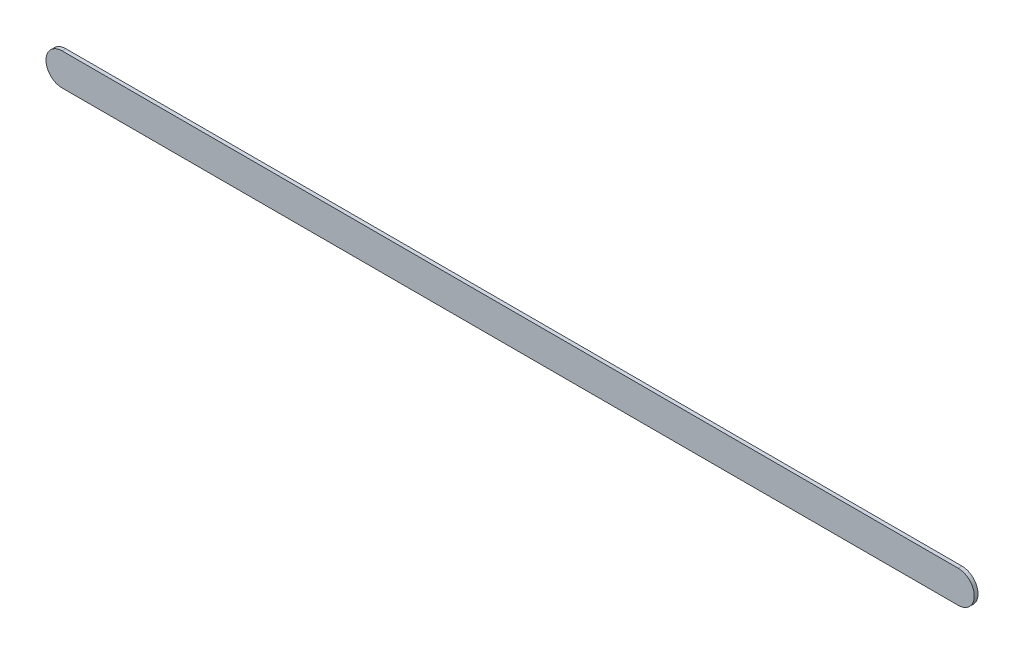
ISO-10303-21;
HEADER;
FILE_DESCRIPTION(('STEP AP214'),'2;1');
FILE_NAME('part.step','',(''),(''),'','','');
FILE_SCHEMA(('AUTOMOTIVE_DESIGN { 1 0 10303 214 1 1 1 1 }'));
ENDSEC;
DATA;
#1=APPLICATION_CONTEXT('core data for automotive mechanical design processes');
#2=APPLICATION_PROTOCOL_DEFINITION('international standard','automotive_design',2000,#1);
#3=PRODUCT_CONTEXT('',#1,'mechanical');
#4=PRODUCT('Part','Part','',(#3));
#5=PRODUCT_RELATED_PRODUCT_CATEGORY('part','',(#4));
#6=PRODUCT_DEFINITION_FORMATION('','',#4);
#7=PRODUCT_DEFINITION_CONTEXT('part definition',#1,'design');
#8=PRODUCT_DEFINITION('design','',#6,#7);
#9=PRODUCT_DEFINITION_SHAPE('','',#8);
#10=(LENGTH_UNIT() NAMED_UNIT(*) SI_UNIT(.MILLI.,.METRE.));
#11=(NAMED_UNIT(*) PLANE_ANGLE_UNIT() SI_UNIT($,.RADIAN.));
#12=(NAMED_UNIT(*) SI_UNIT($,.STERADIAN.) SOLID_ANGLE_UNIT());
#13=UNCERTAINTY_MEASURE_WITH_UNIT(LENGTH_MEASURE(1.E-05),#10,'distance_accuracy_value','');
#14=(GEOMETRIC_REPRESENTATION_CONTEXT(3) GLOBAL_UNCERTAINTY_ASSIGNED_CONTEXT((#13)) GLOBAL_UNIT_ASSIGNED_CONTEXT((#10,
#11,#12)) REPRESENTATION_CONTEXT('',''));
#15=CARTESIAN_POINT('',(0.,0.,0.));
#16=DIRECTION('',(0.,0.,1.));
#17=DIRECTION('',(1.,0.,0.));
#18=AXIS2_PLACEMENT_3D('',#15,#16,#17);
#19=CARTESIAN_POINT('',(101.055,-119.385,1.635));
#20=DIRECTION('',(0.,0.,1.));
#21=DIRECTION('',(1.,0.,0.));
#22=AXIS2_PLACEMENT_3D('',#19,#20,#21);
#23=PLANE('',#22);
#24=DIRECTION('',(-1.,0.,0.));
#25=VECTOR('',#24,1.);
#26=CARTESIAN_POINT('',(101.055,-119.385,1.635));
#27=LINE('',#26,#25);
#28=CARTESIAN_POINT('',(101.055,-119.385,1.635));
#29=VERTEX_POINT('',#28);
#30=CARTESIAN_POINT('',(92.69,-119.385,1.635));
#31=VERTEX_POINT('',#30);
#32=EDGE_CURVE('E82',#29,#31,#27,.T.);
#33=ORIENTED_EDGE('',*,*,#32,.T.);
#34=CARTESIAN_POINT('',(92.69,-119.535,1.635));
#35=DIRECTION('',(0.,0.,1.));
#36=DIRECTION('',(0.,1.,0.));
#37=AXIS2_PLACEMENT_3D('',#34,#35,#36);
#38=CIRCLE('',#37,0.15);
#39=CARTESIAN_POINT('',(92.69,-119.685,1.635));
#40=VERTEX_POINT('',#39);
#41=EDGE_CURVE('E103',#31,#40,#38,.T.);
#42=ORIENTED_EDGE('',*,*,#41,.T.);
#43=DIRECTION('',(1.,0.,0.));
#44=VECTOR('',#43,1.);
#45=CARTESIAN_POINT('',(92.69,-119.685,1.635));
#46=LINE('',#45,#44);
#47=CARTESIAN_POINT('',(101.055,-119.685,1.635));
#48=VERTEX_POINT('',#47);
#49=EDGE_CURVE('E21',#40,#48,#46,.T.);
#50=ORIENTED_EDGE('',*,*,#49,.T.);
#51=CARTESIAN_POINT('',(101.055,-119.535,1.635));
#52=DIRECTION('',(0.,0.,1.));
#53=DIRECTION('',(0.,-1.,0.));
#54=AXIS2_PLACEMENT_3D('',#51,#52,#53);
#55=CIRCLE('',#54,0.15);
#56=EDGE_CURVE('E11',#48,#29,#55,.T.);
#57=ORIENTED_EDGE('',*,*,#56,.T.);
#58=EDGE_LOOP('',(#33,#42,#50,#57));
#59=FACE_BOUND('',#58,.T.);
#60=ADVANCED_FACE('F17',(#59),#23,.T.);
#61=CARTESIAN_POINT('',(101.055,-119.385,1.6));
#62=DIRECTION('',(0.,0.,1.));
#63=DIRECTION('',(1.,0.,0.));
#64=AXIS2_PLACEMENT_3D('',#61,#62,#63);
#65=PLANE('',#64);
#66=CARTESIAN_POINT('',(101.055,-119.535,1.6));
#67=DIRECTION('',(0.,0.,1.));
#68=DIRECTION('',(0.,-1.,0.));
#69=AXIS2_PLACEMENT_3D('',#66,#67,#68);
#70=CIRCLE('',#69,0.15);
#71=CARTESIAN_POINT('',(101.055,-119.685,1.6));
#72=VERTEX_POINT('',#71);
#73=CARTESIAN_POINT('',(101.055,-119.385,1.6));
#74=VERTEX_POINT('',#73);
#75=EDGE_CURVE('E28',#72,#74,#70,.T.);
#76=ORIENTED_EDGE('',*,*,#75,.F.);
#77=DIRECTION('',(1.,0.,0.));
#78=VECTOR('',#77,1.);
#79=CARTESIAN_POINT('',(92.69,-119.685,1.6));
#80=LINE('',#79,#78);
#81=CARTESIAN_POINT('',(92.69,-119.685,1.6));
#82=VERTEX_POINT('',#81);
#83=EDGE_CURVE('E108',#82,#72,#80,.T.);
#84=ORIENTED_EDGE('',*,*,#83,.F.);
#85=CARTESIAN_POINT('',(92.69,-119.535,1.6));
#86=DIRECTION('',(0.,0.,1.));
#87=DIRECTION('',(0.,1.,0.));
#88=AXIS2_PLACEMENT_3D('',#85,#86,#87);
#89=CIRCLE('',#88,0.15);
#90=CARTESIAN_POINT('',(92.69,-119.385,1.6));
#91=VERTEX_POINT('',#90);
#92=EDGE_CURVE('E84',#91,#82,#89,.T.);
#93=ORIENTED_EDGE('',*,*,#92,.F.);
#94=DIRECTION('',(-1.,0.,0.));
#95=VECTOR('',#94,1.);
#96=CARTESIAN_POINT('',(101.055,-119.385,1.6));
#97=LINE('',#96,#95);
#98=EDGE_CURVE('E80',#74,#91,#97,.T.);
#99=ORIENTED_EDGE('',*,*,#98,.F.);
#100=EDGE_LOOP('',(#76,#84,#93,#99));
#101=FACE_BOUND('',#100,.T.);
#102=ADVANCED_FACE('F19',(#101),#65,.F.);
#103=CARTESIAN_POINT('',(101.055,-119.535,1.6));
#104=DIRECTION('',(0.,0.,-1.));
#105=DIRECTION('',(0.,-1.,0.));
#106=AXIS2_PLACEMENT_3D('',#103,#104,#105);
#107=CYLINDRICAL_SURFACE('',#106,0.15);
#108=ORIENTED_EDGE('',*,*,#75,.T.);
#109=DIRECTION('',(0.,0.,1.));
#110=VECTOR('',#109,1.);
#111=CARTESIAN_POINT('',(101.055,-119.385,1.6));
#112=LINE('',#111,#110);
#113=EDGE_CURVE('E67',#74,#29,#112,.T.);
#114=ORIENTED_EDGE('',*,*,#113,.T.);
#115=ORIENTED_EDGE('',*,*,#56,.F.);
#116=DIRECTION('',(0.,0.,1.));
#117=VECTOR('',#116,1.);
#118=CARTESIAN_POINT('',(101.055,-119.685,1.6));
#119=LINE('',#118,#117);
#120=EDGE_CURVE('E70',#72,#48,#119,.T.);
#121=ORIENTED_EDGE('',*,*,#120,.F.);
#122=EDGE_LOOP('',(#108,#114,#115,#121));
#123=FACE_BOUND('',#122,.T.);
#124=ADVANCED_FACE('F66',(#123),#107,.T.);
#125=CARTESIAN_POINT('',(92.69,-119.685,1.6));
#126=DIRECTION('',(0.,1.,0.));
#127=DIRECTION('',(1.,0.,0.));
#128=AXIS2_PLACEMENT_3D('',#125,#126,#127);
#129=PLANE('',#128);
#130=ORIENTED_EDGE('',*,*,#83,.T.);
#131=ORIENTED_EDGE('',*,*,#120,.T.);
#132=ORIENTED_EDGE('',*,*,#49,.F.);
#133=DIRECTION('',(0.,0.,1.));
#134=VECTOR('',#133,1.);
#135=CARTESIAN_POINT('',(92.69,-119.685,1.6));
#136=LINE('',#135,#134);
#137=EDGE_CURVE('E100',#82,#40,#136,.T.);
#138=ORIENTED_EDGE('',*,*,#137,.F.);
#139=EDGE_LOOP('',(#130,#131,#132,#138));
#140=FACE_BOUND('',#139,.T.);
#141=ADVANCED_FACE('F119',(#140),#129,.F.);
#142=CARTESIAN_POINT('',(92.69,-119.535,1.6));
#143=DIRECTION('',(0.,0.,-1.));
#144=DIRECTION('',(0.,1.,0.));
#145=AXIS2_PLACEMENT_3D('',#142,#143,#144);
#146=CYLINDRICAL_SURFACE('',#145,0.15);
#147=ORIENTED_EDGE('',*,*,#92,.T.);
#148=ORIENTED_EDGE('',*,*,#137,.T.);
#149=ORIENTED_EDGE('',*,*,#41,.F.);
#150=DIRECTION('',(0.,0.,1.));
#151=VECTOR('',#150,1.);
#152=CARTESIAN_POINT('',(92.69,-119.385,1.6));
#153=LINE('',#152,#151);
#154=EDGE_CURVE('E89',#91,#31,#153,.T.);
#155=ORIENTED_EDGE('',*,*,#154,.F.);
#156=EDGE_LOOP('',(#147,#148,#149,#155));
#157=FACE_BOUND('',#156,.T.);
#158=ADVANCED_FACE('F121',(#157),#146,.T.);
#159=CARTESIAN_POINT('',(101.055,-119.385,1.6));
#160=DIRECTION('',(0.,-1.,0.));
#161=DIRECTION('',(0.,0.,-1.));
#162=AXIS2_PLACEMENT_3D('',#159,#160,#161);
#163=PLANE('',#162);
#164=ORIENTED_EDGE('',*,*,#98,.T.);
#165=ORIENTED_EDGE('',*,*,#154,.T.);
#166=ORIENTED_EDGE('',*,*,#32,.F.);
#167=ORIENTED_EDGE('',*,*,#113,.F.);
#168=EDGE_LOOP('',(#164,#165,#166,#167));
#169=FACE_BOUND('',#168,.T.);
#170=ADVANCED_FACE('F78',(#169),#163,.F.);
#171=CLOSED_SHELL('',(#60,#102,#124,#141,#158,#170));
#172=MANIFOLD_SOLID_BREP('B1',#171);
#173=ADVANCED_BREP_SHAPE_REPRESENTATION('',(#18,#172),#14);
#174=SHAPE_DEFINITION_REPRESENTATION(#9,#173);
ENDSEC;
END-ISO-10303-21;
